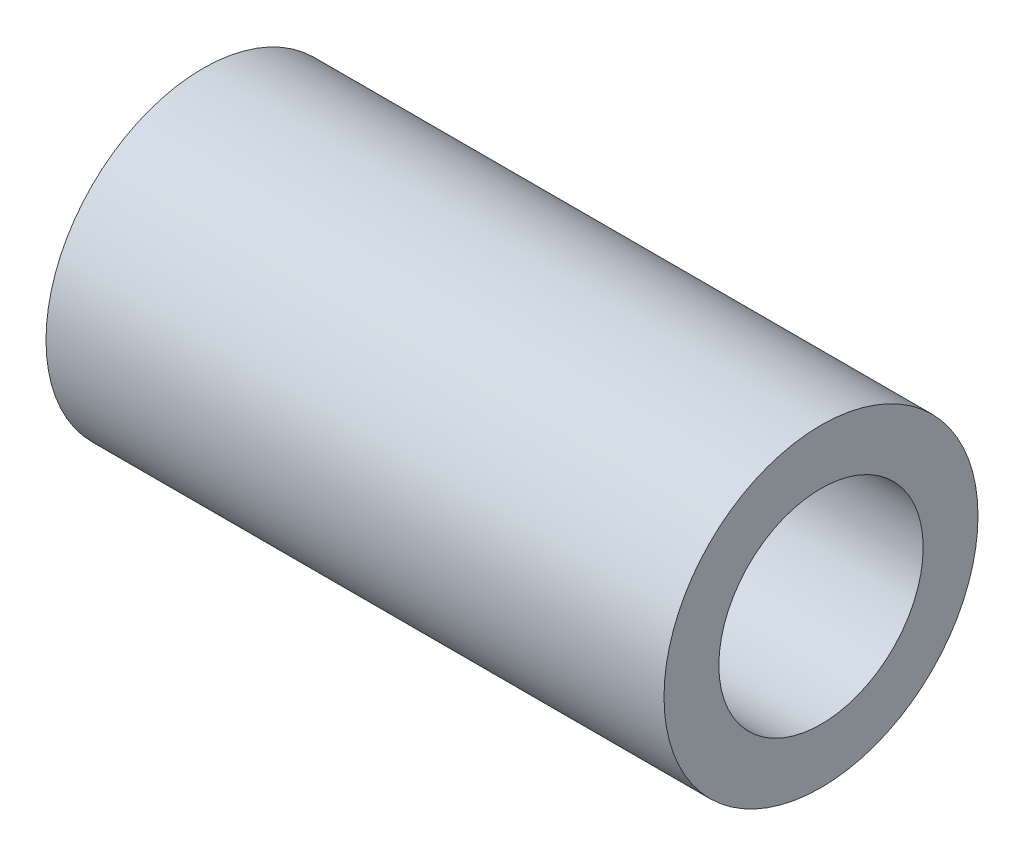
ISO-10303-21;
HEADER;
FILE_DESCRIPTION(('STEP AP214'),'2;1');
FILE_NAME('part.step','',(''),(''),'','','');
FILE_SCHEMA(('AUTOMOTIVE_DESIGN { 1 0 10303 214 1 1 1 1 }'));
ENDSEC;
DATA;
#1=APPLICATION_CONTEXT('core data for automotive mechanical design processes');
#2=APPLICATION_PROTOCOL_DEFINITION('international standard','automotive_design',2000,#1);
#3=PRODUCT_CONTEXT('',#1,'mechanical');
#4=PRODUCT('Part','Part','',(#3));
#5=PRODUCT_RELATED_PRODUCT_CATEGORY('part','',(#4));
#6=PRODUCT_DEFINITION_FORMATION('','',#4);
#7=PRODUCT_DEFINITION_CONTEXT('part definition',#1,'design');
#8=PRODUCT_DEFINITION('design','',#6,#7);
#9=PRODUCT_DEFINITION_SHAPE('','',#8);
#10=(LENGTH_UNIT() NAMED_UNIT(*) SI_UNIT(.MILLI.,.METRE.));
#11=(NAMED_UNIT(*) PLANE_ANGLE_UNIT() SI_UNIT($,.RADIAN.));
#12=(NAMED_UNIT(*) SI_UNIT($,.STERADIAN.) SOLID_ANGLE_UNIT());
#13=UNCERTAINTY_MEASURE_WITH_UNIT(LENGTH_MEASURE(1.E-05),#10,'distance_accuracy_value','');
#14=(GEOMETRIC_REPRESENTATION_CONTEXT(3) GLOBAL_UNCERTAINTY_ASSIGNED_CONTEXT((#13)) GLOBAL_UNIT_ASSIGNED_CONTEXT((#10,
#11,#12)) REPRESENTATION_CONTEXT('',''));
#15=CARTESIAN_POINT('',(0.,0.,0.));
#16=DIRECTION('',(0.,0.,1.));
#17=DIRECTION('',(1.,0.,0.));
#18=AXIS2_PLACEMENT_3D('',#15,#16,#17);
#19=CARTESIAN_POINT('',(-12.4,6.3,0.));
#20=DIRECTION('',(1.,0.,0.));
#21=DIRECTION('',(0.,0.,-1.));
#22=AXIS2_PLACEMENT_3D('',#19,#20,#21);
#23=PLANE('',#22);
#24=CARTESIAN_POINT('',(-12.4,0.,0.));
#25=DIRECTION('',(-1.,0.,0.));
#26=DIRECTION('',(0.,0.,1.));
#27=AXIS2_PLACEMENT_3D('',#24,#25,#26);
#28=CIRCLE('',#27,4.1);
#29=CARTESIAN_POINT('',(-12.4,0.,4.1));
#30=VERTEX_POINT('',#29);
#31=EDGE_CURVE('E10',#30,#30,#28,.T.);
#32=ORIENTED_EDGE('',*,*,#31,.F.);
#33=EDGE_LOOP('',(#32));
#34=FACE_BOUND('',#33,.T.);
#35=CARTESIAN_POINT('',(-12.4,0.,0.));
#36=DIRECTION('',(-1.,0.,0.));
#37=DIRECTION('',(0.,0.,1.));
#38=AXIS2_PLACEMENT_3D('',#35,#36,#37);
#39=CIRCLE('',#38,6.3);
#40=CARTESIAN_POINT('',(-12.4,0.,6.3));
#41=VERTEX_POINT('',#40);
#42=EDGE_CURVE('E56',#41,#41,#39,.T.);
#43=ORIENTED_EDGE('',*,*,#42,.T.);
#44=EDGE_LOOP('',(#43));
#45=FACE_BOUND('',#44,.T.);
#46=ADVANCED_FACE('F38',(#34,#45),#23,.F.);
#47=CARTESIAN_POINT('',(-12.4,0.,0.));
#48=DIRECTION('',(-1.,0.,0.));
#49=DIRECTION('',(0.,0.,1.));
#50=AXIS2_PLACEMENT_3D('',#47,#48,#49);
#51=CYLINDRICAL_SURFACE('',#50,4.1);
#52=CARTESIAN_POINT('',(12.4,0.,0.));
#53=DIRECTION('',(-1.,0.,0.));
#54=DIRECTION('',(0.,0.,1.));
#55=AXIS2_PLACEMENT_3D('',#52,#53,#54);
#56=CIRCLE('',#55,4.1);
#57=CARTESIAN_POINT('',(12.4,0.,4.1));
#58=VERTEX_POINT('',#57);
#59=EDGE_CURVE('E45',#58,#58,#56,.T.);
#60=ORIENTED_EDGE('',*,*,#59,.F.);
#61=EDGE_LOOP('',(#60));
#62=FACE_BOUND('',#61,.T.);
#63=ORIENTED_EDGE('',*,*,#31,.T.);
#64=EDGE_LOOP('',(#63));
#65=FACE_BOUND('',#64,.T.);
#66=ADVANCED_FACE('F71',(#62,#65),#51,.F.);
#67=CARTESIAN_POINT('',(12.4,6.3,0.));
#68=DIRECTION('',(-1.,0.,0.));
#69=DIRECTION('',(0.,0.,1.));
#70=AXIS2_PLACEMENT_3D('',#67,#68,#69);
#71=PLANE('',#70);
#72=CARTESIAN_POINT('',(12.4,0.,0.));
#73=DIRECTION('',(-1.,0.,0.));
#74=DIRECTION('',(0.,0.,1.));
#75=AXIS2_PLACEMENT_3D('',#72,#73,#74);
#76=CIRCLE('',#75,6.3);
#77=CARTESIAN_POINT('',(12.4,0.,6.3));
#78=VERTEX_POINT('',#77);
#79=EDGE_CURVE('E51',#78,#78,#76,.T.);
#80=ORIENTED_EDGE('',*,*,#79,.F.);
#81=EDGE_LOOP('',(#80));
#82=FACE_BOUND('',#81,.T.);
#83=ORIENTED_EDGE('',*,*,#59,.T.);
#84=EDGE_LOOP('',(#83));
#85=FACE_BOUND('',#84,.T.);
#86=ADVANCED_FACE('F66',(#82,#85),#71,.F.);
#87=CARTESIAN_POINT('',(-12.4,0.,0.));
#88=DIRECTION('',(-1.,0.,0.));
#89=DIRECTION('',(0.,0.,1.));
#90=AXIS2_PLACEMENT_3D('',#87,#88,#89);
#91=CYLINDRICAL_SURFACE('',#90,6.3);
#92=ORIENTED_EDGE('',*,*,#42,.F.);
#93=EDGE_LOOP('',(#92));
#94=FACE_BOUND('',#93,.T.);
#95=ORIENTED_EDGE('',*,*,#79,.T.);
#96=EDGE_LOOP('',(#95));
#97=FACE_BOUND('',#96,.T.);
#98=ADVANCED_FACE('F63',(#94,#97),#91,.T.);
#99=CLOSED_SHELL('',(#46,#66,#86,#98));
#100=MANIFOLD_SOLID_BREP('B2',#99);
#101=ADVANCED_BREP_SHAPE_REPRESENTATION('',(#18,#100),#14);
#102=SHAPE_DEFINITION_REPRESENTATION(#9,#101);
ENDSEC;
END-ISO-10303-21;
